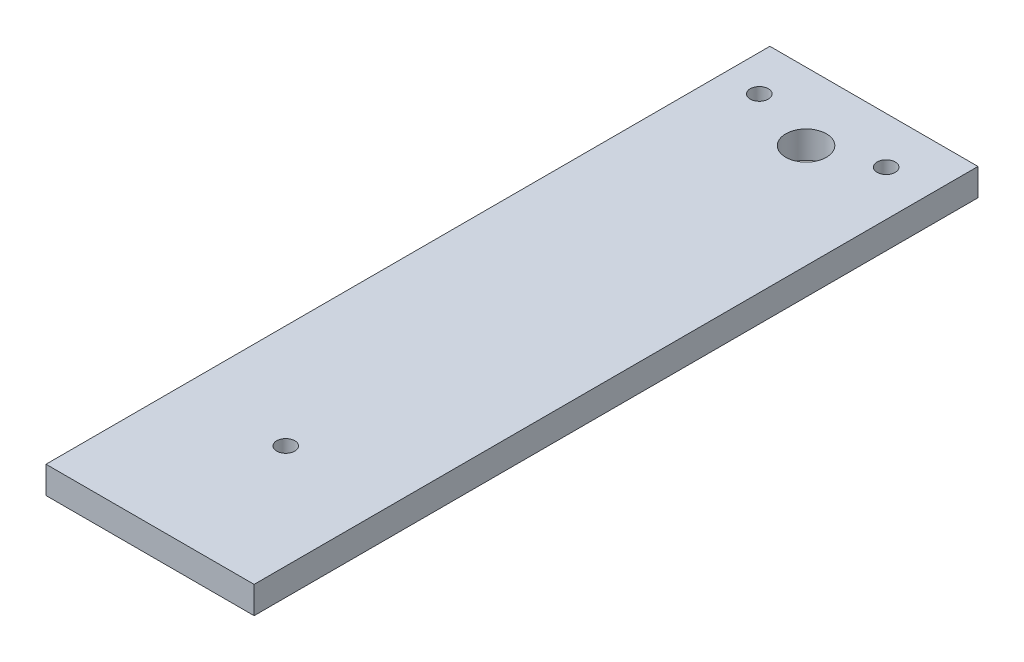
ISO-10303-21;
HEADER;
FILE_DESCRIPTION(('STEP AP214'),'2;1');
FILE_NAME('part.step','',(''),(''),'','','');
FILE_SCHEMA(('AUTOMOTIVE_DESIGN { 1 0 10303 214 1 1 1 1 }'));
ENDSEC;
DATA;
#1=APPLICATION_CONTEXT('core data for automotive mechanical design processes');
#2=APPLICATION_PROTOCOL_DEFINITION('international standard','automotive_design',2000,#1);
#3=PRODUCT_CONTEXT('',#1,'mechanical');
#4=PRODUCT('Part','Part','',(#3));
#5=PRODUCT_RELATED_PRODUCT_CATEGORY('part','',(#4));
#6=PRODUCT_DEFINITION_FORMATION('','',#4);
#7=PRODUCT_DEFINITION_CONTEXT('part definition',#1,'design');
#8=PRODUCT_DEFINITION('design','',#6,#7);
#9=PRODUCT_DEFINITION_SHAPE('','',#8);
#10=(LENGTH_UNIT() NAMED_UNIT(*) SI_UNIT(.MILLI.,.METRE.));
#11=(NAMED_UNIT(*) PLANE_ANGLE_UNIT() SI_UNIT($,.RADIAN.));
#12=(NAMED_UNIT(*) SI_UNIT($,.STERADIAN.) SOLID_ANGLE_UNIT());
#13=UNCERTAINTY_MEASURE_WITH_UNIT(LENGTH_MEASURE(1.E-05),#10,'distance_accuracy_value','');
#14=(GEOMETRIC_REPRESENTATION_CONTEXT(3) GLOBAL_UNCERTAINTY_ASSIGNED_CONTEXT((#13)) GLOBAL_UNIT_ASSIGNED_CONTEXT((#10,
#11,#12)) REPRESENTATION_CONTEXT('',''));
#15=CARTESIAN_POINT('',(0.,0.,0.));
#16=DIRECTION('',(0.,0.,1.));
#17=DIRECTION('',(1.,0.,0.));
#18=AXIS2_PLACEMENT_3D('',#15,#16,#17);
#19=CARTESIAN_POINT('',(-11.5,1.5,80.));
#20=DIRECTION('',(1.,0.,0.));
#21=DIRECTION('',(0.,0.,-1.));
#22=AXIS2_PLACEMENT_3D('',#19,#20,#21);
#23=PLANE('',#22);
#24=DIRECTION('',(0.,-1.,0.));
#25=VECTOR('',#24,1.);
#26=CARTESIAN_POINT('',(-11.5,1.5,0.));
#27=LINE('',#26,#25);
#28=CARTESIAN_POINT('',(-11.5,1.5,0.));
#29=VERTEX_POINT('',#28);
#30=CARTESIAN_POINT('',(-11.5,-1.5,0.));
#31=VERTEX_POINT('',#30);
#32=EDGE_CURVE('E105',#29,#31,#27,.T.);
#33=ORIENTED_EDGE('',*,*,#32,.T.);
#34=DIRECTION('',(0.,0.,-1.));
#35=VECTOR('',#34,1.);
#36=CARTESIAN_POINT('',(-11.5,-1.5,80.));
#37=LINE('',#36,#35);
#38=CARTESIAN_POINT('',(-11.5,-1.5,80.));
#39=VERTEX_POINT('',#38);
#40=EDGE_CURVE('E11',#39,#31,#37,.T.);
#41=ORIENTED_EDGE('',*,*,#40,.F.);
#42=DIRECTION('',(0.,-1.,0.));
#43=VECTOR('',#42,1.);
#44=CARTESIAN_POINT('',(-11.5,1.5,80.));
#45=LINE('',#44,#43);
#46=CARTESIAN_POINT('',(-11.5,1.5,80.));
#47=VERTEX_POINT('',#46);
#48=EDGE_CURVE('E92',#47,#39,#45,.T.);
#49=ORIENTED_EDGE('',*,*,#48,.F.);
#50=DIRECTION('',(0.,0.,-1.));
#51=VECTOR('',#50,1.);
#52=CARTESIAN_POINT('',(-11.5,1.5,80.));
#53=LINE('',#52,#51);
#54=EDGE_CURVE('E101',#47,#29,#53,.T.);
#55=ORIENTED_EDGE('',*,*,#54,.T.);
#56=EDGE_LOOP('',(#33,#41,#49,#55));
#57=FACE_BOUND('',#56,.T.);
#58=ADVANCED_FACE('F39',(#57),#23,.F.);
#59=CARTESIAN_POINT('',(11.5,-1.5,80.));
#60=DIRECTION('',(0.,1.,0.));
#61=DIRECTION('',(-1.,0.,0.));
#62=AXIS2_PLACEMENT_3D('',#59,#60,#61);
#63=PLANE('',#62);
#64=CARTESIAN_POINT('',(0.,-1.5,7.5));
#65=DIRECTION('',(0.,1.,0.));
#66=DIRECTION('',(-1.,0.,0.));
#67=AXIS2_PLACEMENT_3D('',#64,#65,#66);
#68=CIRCLE('',#67,2.25);
#69=CARTESIAN_POINT('',(-2.25,-1.5,7.5));
#70=VERTEX_POINT('',#69);
#71=EDGE_CURVE('E128',#70,#70,#68,.T.);
#72=ORIENTED_EDGE('',*,*,#71,.T.);
#73=EDGE_LOOP('',(#72));
#74=FACE_BOUND('',#73,.T.);
#75=CARTESIAN_POINT('',(6.49733066088665,-1.5,5.14416113779248));
#76=DIRECTION('',(0.,-1.,0.));
#77=DIRECTION('',(1.,0.,0.));
#78=AXIS2_PLACEMENT_3D('',#75,#76,#77);
#79=CIRCLE('',#78,1.);
#80=CARTESIAN_POINT('',(7.49733066088665,-1.5,5.14416113779248));
#81=VERTEX_POINT('',#80);
#82=EDGE_CURVE('E118',#81,#81,#79,.T.);
#83=ORIENTED_EDGE('',*,*,#82,.F.);
#84=EDGE_LOOP('',(#83));
#85=FACE_BOUND('',#84,.T.);
#86=CARTESIAN_POINT('',(-7.52483660311221,-1.5,5.14416113779248));
#87=DIRECTION('',(0.,-1.,0.));
#88=DIRECTION('',(1.,0.,0.));
#89=AXIS2_PLACEMENT_3D('',#86,#87,#88);
#90=CIRCLE('',#89,1.);
#91=CARTESIAN_POINT('',(-6.52483660311221,-1.5,5.14416113779248));
#92=VERTEX_POINT('',#91);
#93=EDGE_CURVE('E123',#92,#92,#90,.T.);
#94=ORIENTED_EDGE('',*,*,#93,.F.);
#95=EDGE_LOOP('',(#94));
#96=FACE_BOUND('',#95,.T.);
#97=CARTESIAN_POINT('',(0.,-1.5,65.));
#98=DIRECTION('',(0.,-1.,0.));
#99=DIRECTION('',(1.,0.,0.));
#100=AXIS2_PLACEMENT_3D('',#97,#98,#99);
#101=CIRCLE('',#100,1.);
#102=CARTESIAN_POINT('',(1.,-1.5,65.));
#103=VERTEX_POINT('',#102);
#104=EDGE_CURVE('E115',#103,#103,#101,.T.);
#105=ORIENTED_EDGE('',*,*,#104,.F.);
#106=EDGE_LOOP('',(#105));
#107=FACE_BOUND('',#106,.T.);
#108=DIRECTION('',(1.,0.,0.));
#109=VECTOR('',#108,1.);
#110=CARTESIAN_POINT('',(11.5,-1.5,0.));
#111=LINE('',#110,#109);
#112=CARTESIAN_POINT('',(11.5,-1.5,0.));
#113=VERTEX_POINT('',#112);
#114=EDGE_CURVE('E96',#31,#113,#111,.T.);
#115=ORIENTED_EDGE('',*,*,#114,.T.);
#116=DIRECTION('',(0.,0.,-1.));
#117=VECTOR('',#116,1.);
#118=CARTESIAN_POINT('',(11.5,-1.5,80.));
#119=LINE('',#118,#117);
#120=CARTESIAN_POINT('',(11.5,-1.5,80.));
#121=VERTEX_POINT('',#120);
#122=EDGE_CURVE('E48',#121,#113,#119,.T.);
#123=ORIENTED_EDGE('',*,*,#122,.F.);
#124=DIRECTION('',(1.,0.,0.));
#125=VECTOR('',#124,1.);
#126=CARTESIAN_POINT('',(11.5,-1.5,80.));
#127=LINE('',#126,#125);
#128=EDGE_CURVE('E87',#39,#121,#127,.T.);
#129=ORIENTED_EDGE('',*,*,#128,.F.);
#130=ORIENTED_EDGE('',*,*,#40,.T.);
#131=EDGE_LOOP('',(#115,#123,#129,#130));
#132=FACE_BOUND('',#131,.T.);
#133=ADVANCED_FACE('F95',(#74,#85,#96,#107,#132),#63,.F.);
#134=CARTESIAN_POINT('',(11.5,1.5,80.));
#135=DIRECTION('',(-1.,0.,0.));
#136=DIRECTION('',(0.,0.,1.));
#137=AXIS2_PLACEMENT_3D('',#134,#135,#136);
#138=PLANE('',#137);
#139=DIRECTION('',(0.,1.,0.));
#140=VECTOR('',#139,1.);
#141=CARTESIAN_POINT('',(11.5,1.5,0.));
#142=LINE('',#141,#140);
#143=CARTESIAN_POINT('',(11.5,1.5,0.));
#144=VERTEX_POINT('',#143);
#145=EDGE_CURVE('E74',#113,#144,#142,.T.);
#146=ORIENTED_EDGE('',*,*,#145,.T.);
#147=DIRECTION('',(0.,0.,-1.));
#148=VECTOR('',#147,1.);
#149=CARTESIAN_POINT('',(11.5,1.5,80.));
#150=LINE('',#149,#148);
#151=CARTESIAN_POINT('',(11.5,1.5,80.));
#152=VERTEX_POINT('',#151);
#153=EDGE_CURVE('E97',#152,#144,#150,.T.);
#154=ORIENTED_EDGE('',*,*,#153,.F.);
#155=DIRECTION('',(0.,1.,0.));
#156=VECTOR('',#155,1.);
#157=CARTESIAN_POINT('',(11.5,1.5,80.));
#158=LINE('',#157,#156);
#159=EDGE_CURVE('E90',#121,#152,#158,.T.);
#160=ORIENTED_EDGE('',*,*,#159,.F.);
#161=ORIENTED_EDGE('',*,*,#122,.T.);
#162=EDGE_LOOP('',(#146,#154,#160,#161));
#163=FACE_BOUND('',#162,.T.);
#164=ADVANCED_FACE('F99',(#163),#138,.F.);
#165=CARTESIAN_POINT('',(11.5,1.5,80.));
#166=DIRECTION('',(0.,-1.,0.));
#167=DIRECTION('',(1.,0.,0.));
#168=AXIS2_PLACEMENT_3D('',#165,#166,#167);
#169=PLANE('',#168);
#170=CARTESIAN_POINT('',(0.,1.5,7.5));
#171=DIRECTION('',(0.,1.,0.));
#172=DIRECTION('',(-1.,0.,0.));
#173=AXIS2_PLACEMENT_3D('',#170,#171,#172);
#174=CIRCLE('',#173,2.25);
#175=CARTESIAN_POINT('',(-2.25,1.5,7.5));
#176=VERTEX_POINT('',#175);
#177=EDGE_CURVE('E131',#176,#176,#174,.T.);
#178=ORIENTED_EDGE('',*,*,#177,.F.);
#179=EDGE_LOOP('',(#178));
#180=FACE_BOUND('',#179,.T.);
#181=CARTESIAN_POINT('',(6.49733066088665,1.5,5.14416113779248));
#182=DIRECTION('',(0.,-1.,0.));
#183=DIRECTION('',(1.,0.,0.));
#184=AXIS2_PLACEMENT_3D('',#181,#182,#183);
#185=CIRCLE('',#184,1.);
#186=CARTESIAN_POINT('',(7.49733066088665,1.5,5.14416113779248));
#187=VERTEX_POINT('',#186);
#188=EDGE_CURVE('E42',#187,#187,#185,.T.);
#189=ORIENTED_EDGE('',*,*,#188,.T.);
#190=EDGE_LOOP('',(#189));
#191=FACE_BOUND('',#190,.T.);
#192=CARTESIAN_POINT('',(-7.52483660311221,1.5,5.14416113779248));
#193=DIRECTION('',(0.,-1.,0.));
#194=DIRECTION('',(1.,0.,0.));
#195=AXIS2_PLACEMENT_3D('',#192,#193,#194);
#196=CIRCLE('',#195,1.);
#197=CARTESIAN_POINT('',(-6.52483660311221,1.5,5.14416113779248));
#198=VERTEX_POINT('',#197);
#199=EDGE_CURVE('E116',#198,#198,#196,.T.);
#200=ORIENTED_EDGE('',*,*,#199,.T.);
#201=EDGE_LOOP('',(#200));
#202=FACE_BOUND('',#201,.T.);
#203=CARTESIAN_POINT('',(0.,1.5,65.));
#204=DIRECTION('',(0.,-1.,0.));
#205=DIRECTION('',(1.,0.,0.));
#206=AXIS2_PLACEMENT_3D('',#203,#204,#205);
#207=CIRCLE('',#206,1.);
#208=CARTESIAN_POINT('',(1.,1.5,65.));
#209=VERTEX_POINT('',#208);
#210=EDGE_CURVE('E108',#209,#209,#207,.T.);
#211=ORIENTED_EDGE('',*,*,#210,.T.);
#212=EDGE_LOOP('',(#211));
#213=FACE_BOUND('',#212,.T.);
#214=DIRECTION('',(-1.,0.,0.));
#215=VECTOR('',#214,1.);
#216=CARTESIAN_POINT('',(11.5,1.5,0.));
#217=LINE('',#216,#215);
#218=EDGE_CURVE('E80',#144,#29,#217,.T.);
#219=ORIENTED_EDGE('',*,*,#218,.T.);
#220=ORIENTED_EDGE('',*,*,#54,.F.);
#221=DIRECTION('',(-1.,0.,0.));
#222=VECTOR('',#221,1.);
#223=CARTESIAN_POINT('',(11.5,1.5,80.));
#224=LINE('',#223,#222);
#225=EDGE_CURVE('E57',#152,#47,#224,.T.);
#226=ORIENTED_EDGE('',*,*,#225,.F.);
#227=ORIENTED_EDGE('',*,*,#153,.T.);
#228=EDGE_LOOP('',(#219,#220,#226,#227));
#229=FACE_BOUND('',#228,.T.);
#230=ADVANCED_FACE('F147',(#180,#191,#202,#213,#229),#169,.F.);
#231=CARTESIAN_POINT('',(0.,0.,80.));
#232=DIRECTION('',(0.,0.,-1.));
#233=DIRECTION('',(-1.,0.,0.));
#234=AXIS2_PLACEMENT_3D('',#231,#232,#233);
#235=PLANE('',#234);
#236=ORIENTED_EDGE('',*,*,#48,.T.);
#237=ORIENTED_EDGE('',*,*,#128,.T.);
#238=ORIENTED_EDGE('',*,*,#159,.T.);
#239=ORIENTED_EDGE('',*,*,#225,.T.);
#240=EDGE_LOOP('',(#236,#237,#238,#239));
#241=FACE_BOUND('',#240,.T.);
#242=ADVANCED_FACE('F88',(#241),#235,.F.);
#243=CARTESIAN_POINT('',(0.,0.,0.));
#244=DIRECTION('',(0.,0.,-1.));
#245=DIRECTION('',(-1.,0.,0.));
#246=AXIS2_PLACEMENT_3D('',#243,#244,#245);
#247=PLANE('',#246);
#248=ORIENTED_EDGE('',*,*,#32,.F.);
#249=ORIENTED_EDGE('',*,*,#218,.F.);
#250=ORIENTED_EDGE('',*,*,#145,.F.);
#251=ORIENTED_EDGE('',*,*,#114,.F.);
#252=EDGE_LOOP('',(#248,#249,#250,#251));
#253=FACE_BOUND('',#252,.T.);
#254=ADVANCED_FACE('F156',(#253),#247,.T.);
#255=CARTESIAN_POINT('',(0.,8.5,65.));
#256=DIRECTION('',(0.,-1.,0.));
#257=DIRECTION('',(1.,0.,0.));
#258=AXIS2_PLACEMENT_3D('',#255,#256,#257);
#259=CYLINDRICAL_SURFACE('',#258,1.);
#260=ORIENTED_EDGE('',*,*,#104,.T.);
#261=EDGE_LOOP('',(#260));
#262=FACE_BOUND('',#261,.T.);
#263=ORIENTED_EDGE('',*,*,#210,.F.);
#264=EDGE_LOOP('',(#263));
#265=FACE_BOUND('',#264,.T.);
#266=ADVANCED_FACE('F137',(#262,#265),#259,.F.);
#267=CARTESIAN_POINT('',(-7.52483660311221,8.5,5.14416113779248));
#268=DIRECTION('',(0.,-1.,0.));
#269=DIRECTION('',(1.,0.,0.));
#270=AXIS2_PLACEMENT_3D('',#267,#268,#269);
#271=CYLINDRICAL_SURFACE('',#270,1.);
#272=ORIENTED_EDGE('',*,*,#93,.T.);
#273=EDGE_LOOP('',(#272));
#274=FACE_BOUND('',#273,.T.);
#275=ORIENTED_EDGE('',*,*,#199,.F.);
#276=EDGE_LOOP('',(#275));
#277=FACE_BOUND('',#276,.T.);
#278=ADVANCED_FACE('F164',(#274,#277),#271,.F.);
#279=CARTESIAN_POINT('',(6.49733066088665,8.5,5.14416113779248));
#280=DIRECTION('',(0.,-1.,0.));
#281=DIRECTION('',(1.,0.,0.));
#282=AXIS2_PLACEMENT_3D('',#279,#280,#281);
#283=CYLINDRICAL_SURFACE('',#282,1.);
#284=ORIENTED_EDGE('',*,*,#82,.T.);
#285=EDGE_LOOP('',(#284));
#286=FACE_BOUND('',#285,.T.);
#287=ORIENTED_EDGE('',*,*,#188,.F.);
#288=EDGE_LOOP('',(#287));
#289=FACE_BOUND('',#288,.T.);
#290=ADVANCED_FACE('F167',(#286,#289),#283,.F.);
#291=CARTESIAN_POINT('',(0.,-1.5,7.5));
#292=DIRECTION('',(0.,1.,0.));
#293=DIRECTION('',(-1.,0.,0.));
#294=AXIS2_PLACEMENT_3D('',#291,#292,#293);
#295=CYLINDRICAL_SURFACE('',#294,2.25);
#296=ORIENTED_EDGE('',*,*,#71,.F.);
#297=EDGE_LOOP('',(#296));
#298=FACE_BOUND('',#297,.T.);
#299=ORIENTED_EDGE('',*,*,#177,.T.);
#300=EDGE_LOOP('',(#299));
#301=FACE_BOUND('',#300,.T.);
#302=ADVANCED_FACE('F171',(#298,#301),#295,.F.);
#303=CLOSED_SHELL('',(#58,#133,#164,#230,#242,#254,#266,#278,#290,#302));
#304=MANIFOLD_SOLID_BREP('B2',#303);
#305=ADVANCED_BREP_SHAPE_REPRESENTATION('',(#18,#304),#14);
#306=SHAPE_DEFINITION_REPRESENTATION(#9,#305);
ENDSEC;
END-ISO-10303-21;
